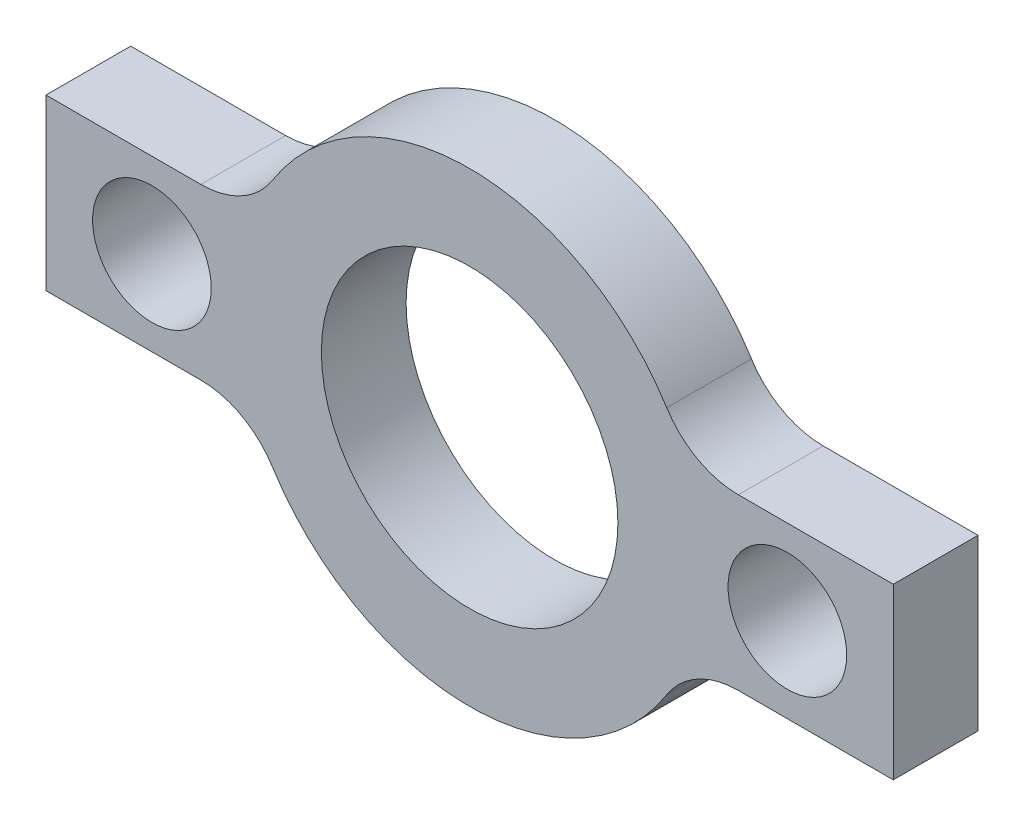
ISO-10303-21;
HEADER;
FILE_DESCRIPTION(('STEP AP214'),'2;1');
FILE_NAME('part.step','',(''),(''),'','','');
FILE_SCHEMA(('AUTOMOTIVE_DESIGN { 1 0 10303 214 1 1 1 1 }'));
ENDSEC;
DATA;
#1=APPLICATION_CONTEXT('core data for automotive mechanical design processes');
#2=APPLICATION_PROTOCOL_DEFINITION('international standard','automotive_design',2000,#1);
#3=PRODUCT_CONTEXT('',#1,'mechanical');
#4=PRODUCT('Part','Part','',(#3));
#5=PRODUCT_RELATED_PRODUCT_CATEGORY('part','',(#4));
#6=PRODUCT_DEFINITION_FORMATION('','',#4);
#7=PRODUCT_DEFINITION_CONTEXT('part definition',#1,'design');
#8=PRODUCT_DEFINITION('design','',#6,#7);
#9=PRODUCT_DEFINITION_SHAPE('','',#8);
#10=(LENGTH_UNIT() NAMED_UNIT(*) SI_UNIT(.MILLI.,.METRE.));
#11=(NAMED_UNIT(*) PLANE_ANGLE_UNIT() SI_UNIT($,.RADIAN.));
#12=(NAMED_UNIT(*) SI_UNIT($,.STERADIAN.) SOLID_ANGLE_UNIT());
#13=UNCERTAINTY_MEASURE_WITH_UNIT(LENGTH_MEASURE(1.E-05),#10,'distance_accuracy_value','');
#14=(GEOMETRIC_REPRESENTATION_CONTEXT(3) GLOBAL_UNCERTAINTY_ASSIGNED_CONTEXT((#13)) GLOBAL_UNIT_ASSIGNED_CONTEXT((#10,
#11,#12)) REPRESENTATION_CONTEXT('',''));
#15=CARTESIAN_POINT('',(0.,0.,0.));
#16=DIRECTION('',(0.,0.,1.));
#17=DIRECTION('',(1.,0.,0.));
#18=AXIS2_PLACEMENT_3D('',#15,#16,#17);
#19=CARTESIAN_POINT('',(6.34428877022476,4.,2.));
#20=DIRECTION('',(0.,0.,1.));
#21=DIRECTION('',(1.,0.,0.));
#22=AXIS2_PLACEMENT_3D('',#19,#20,#21);
#23=PLANE('',#22);
#24=CARTESIAN_POINT('',(-7.5,0.,2.));
#25=DIRECTION('',(0.,0.,1.));
#26=DIRECTION('',(1.,0.,0.));
#27=AXIS2_PLACEMENT_3D('',#24,#25,#26);
#28=CIRCLE('',#27,1.4);
#29=CARTESIAN_POINT('',(-6.1,0.,2.));
#30=VERTEX_POINT('',#29);
#31=EDGE_CURVE('E289',#30,#30,#28,.T.);
#32=ORIENTED_EDGE('',*,*,#31,.F.);
#33=EDGE_LOOP('',(#32));
#34=FACE_BOUND('',#33,.T.);
#35=CARTESIAN_POINT('',(6.34428877022476,4.,2.));
#36=DIRECTION('',(0.,0.,-1.));
#37=DIRECTION('',(1.,0.,0.));
#38=AXIS2_PLACEMENT_3D('',#35,#36,#37);
#39=CIRCLE('',#38,2.);
#40=CARTESIAN_POINT('',(6.34428877022476,2.,2.));
#41=VERTEX_POINT('',#40);
#42=CARTESIAN_POINT('',(4.65247843149816,2.93333333333333,2.));
#43=VERTEX_POINT('',#42);
#44=EDGE_CURVE('E180',#41,#43,#39,.T.);
#45=ORIENTED_EDGE('',*,*,#44,.T.);
#46=CARTESIAN_POINT('',(0.,0.,2.));
#47=DIRECTION('',(0.,0.,1.));
#48=DIRECTION('',(1.,0.,0.));
#49=AXIS2_PLACEMENT_3D('',#46,#47,#48);
#50=CIRCLE('',#49,5.5);
#51=CARTESIAN_POINT('',(-4.65247843149816,2.93333333333333,2.));
#52=VERTEX_POINT('',#51);
#53=EDGE_CURVE('E108',#43,#52,#50,.T.);
#54=ORIENTED_EDGE('',*,*,#53,.T.);
#55=CARTESIAN_POINT('',(-6.34428877022476,4.,2.));
#56=DIRECTION('',(0.,0.,-1.));
#57=DIRECTION('',(1.,0.,0.));
#58=AXIS2_PLACEMENT_3D('',#55,#56,#57);
#59=CIRCLE('',#58,2.);
#60=CARTESIAN_POINT('',(-6.34428877022476,2.,2.));
#61=VERTEX_POINT('',#60);
#62=EDGE_CURVE('E207',#52,#61,#59,.T.);
#63=ORIENTED_EDGE('',*,*,#62,.T.);
#64=DIRECTION('',(-1.,0.,0.));
#65=VECTOR('',#64,1.);
#66=CARTESIAN_POINT('',(-10.,2.,2.));
#67=LINE('',#66,#65);
#68=CARTESIAN_POINT('',(-10.,2.,2.));
#69=VERTEX_POINT('',#68);
#70=EDGE_CURVE('E226',#61,#69,#67,.T.);
#71=ORIENTED_EDGE('',*,*,#70,.T.);
#72=DIRECTION('',(0.,-1.,0.));
#73=VECTOR('',#72,1.);
#74=CARTESIAN_POINT('',(-10.,2.,2.));
#75=LINE('',#74,#73);
#76=CARTESIAN_POINT('',(-10.,-2.,2.));
#77=VERTEX_POINT('',#76);
#78=EDGE_CURVE('E223',#69,#77,#75,.T.);
#79=ORIENTED_EDGE('',*,*,#78,.T.);
#80=DIRECTION('',(1.,0.,0.));
#81=VECTOR('',#80,1.);
#82=CARTESIAN_POINT('',(-10.,-2.,2.));
#83=LINE('',#82,#81);
#84=CARTESIAN_POINT('',(-6.34428877022476,-2.,2.));
#85=VERTEX_POINT('',#84);
#86=EDGE_CURVE('E225',#77,#85,#83,.T.);
#87=ORIENTED_EDGE('',*,*,#86,.T.);
#88=CARTESIAN_POINT('',(-6.34428877022476,-4.,2.));
#89=DIRECTION('',(0.,0.,-1.));
#90=DIRECTION('',(-1.,0.,0.));
#91=AXIS2_PLACEMENT_3D('',#88,#89,#90);
#92=CIRCLE('',#91,2.);
#93=CARTESIAN_POINT('',(-4.65247843149816,-2.93333333333333,2.));
#94=VERTEX_POINT('',#93);
#95=EDGE_CURVE('E228',#85,#94,#92,.T.);
#96=ORIENTED_EDGE('',*,*,#95,.T.);
#97=CARTESIAN_POINT('',(0.,0.,2.));
#98=DIRECTION('',(0.,0.,1.));
#99=DIRECTION('',(1.,0.,0.));
#100=AXIS2_PLACEMENT_3D('',#97,#98,#99);
#101=CIRCLE('',#100,5.5);
#102=CARTESIAN_POINT('',(4.65247843149815,-2.93333333333334,2.));
#103=VERTEX_POINT('',#102);
#104=EDGE_CURVE('E234',#94,#103,#101,.T.);
#105=ORIENTED_EDGE('',*,*,#104,.T.);
#106=CARTESIAN_POINT('',(6.34428877022476,-4.,2.));
#107=DIRECTION('',(0.,0.,-1.));
#108=DIRECTION('',(1.,0.,0.));
#109=AXIS2_PLACEMENT_3D('',#106,#107,#108);
#110=CIRCLE('',#109,2.);
#111=CARTESIAN_POINT('',(6.34428877022476,-2.,2.));
#112=VERTEX_POINT('',#111);
#113=EDGE_CURVE('E139',#103,#112,#110,.T.);
#114=ORIENTED_EDGE('',*,*,#113,.T.);
#115=DIRECTION('',(1.,0.,0.));
#116=VECTOR('',#115,1.);
#117=CARTESIAN_POINT('',(6.34428877022476,-2.,2.));
#118=LINE('',#117,#116);
#119=CARTESIAN_POINT('',(10.,-2.,2.));
#120=VERTEX_POINT('',#119);
#121=EDGE_CURVE('E133',#112,#120,#118,.T.);
#122=ORIENTED_EDGE('',*,*,#121,.T.);
#123=DIRECTION('',(0.,1.,0.));
#124=VECTOR('',#123,1.);
#125=CARTESIAN_POINT('',(10.,2.,2.));
#126=LINE('',#125,#124);
#127=CARTESIAN_POINT('',(10.,2.,2.));
#128=VERTEX_POINT('',#127);
#129=EDGE_CURVE('E137',#120,#128,#126,.T.);
#130=ORIENTED_EDGE('',*,*,#129,.T.);
#131=DIRECTION('',(-1.,0.,0.));
#132=VECTOR('',#131,1.);
#133=CARTESIAN_POINT('',(6.34428877022476,2.,2.));
#134=LINE('',#133,#132);
#135=EDGE_CURVE('E53',#128,#41,#134,.T.);
#136=ORIENTED_EDGE('',*,*,#135,.T.);
#137=EDGE_LOOP('',(#45,#54,#63,#71,#79,#87,#96,#105,#114,#122,#130,#136));
#138=FACE_BOUND('',#137,.T.);
#139=CARTESIAN_POINT('',(0.,0.,2.));
#140=DIRECTION('',(0.,0.,1.));
#141=DIRECTION('',(1.,0.,0.));
#142=AXIS2_PLACEMENT_3D('',#139,#140,#141);
#143=CIRCLE('',#142,3.5);
#144=CARTESIAN_POINT('',(3.5,0.,2.));
#145=VERTEX_POINT('',#144);
#146=EDGE_CURVE('E161',#145,#145,#143,.T.);
#147=ORIENTED_EDGE('',*,*,#146,.F.);
#148=EDGE_LOOP('',(#147));
#149=FACE_BOUND('',#148,.T.);
#150=CARTESIAN_POINT('',(7.5,0.,2.));
#151=DIRECTION('',(0.,0.,1.));
#152=DIRECTION('',(1.,0.,0.));
#153=AXIS2_PLACEMENT_3D('',#150,#151,#152);
#154=CIRCLE('',#153,1.4);
#155=CARTESIAN_POINT('',(8.9,0.,2.));
#156=VERTEX_POINT('',#155);
#157=EDGE_CURVE('E280',#156,#156,#154,.T.);
#158=ORIENTED_EDGE('',*,*,#157,.F.);
#159=EDGE_LOOP('',(#158));
#160=FACE_BOUND('',#159,.T.);
#161=ADVANCED_FACE('F36',(#34,#138,#149,#160),#23,.T.);
#162=CARTESIAN_POINT('',(6.34428877022476,4.,0.));
#163=DIRECTION('',(0.,0.,1.));
#164=DIRECTION('',(1.,0.,0.));
#165=AXIS2_PLACEMENT_3D('',#162,#163,#164);
#166=PLANE('',#165);
#167=CARTESIAN_POINT('',(6.34428877022476,4.,0.));
#168=DIRECTION('',(0.,0.,-1.));
#169=DIRECTION('',(1.,0.,0.));
#170=AXIS2_PLACEMENT_3D('',#167,#168,#169);
#171=CIRCLE('',#170,2.);
#172=CARTESIAN_POINT('',(6.34428877022476,2.,0.));
#173=VERTEX_POINT('',#172);
#174=CARTESIAN_POINT('',(4.65247843149816,2.93333333333333,0.));
#175=VERTEX_POINT('',#174);
#176=EDGE_CURVE('E157',#173,#175,#171,.T.);
#177=ORIENTED_EDGE('',*,*,#176,.F.);
#178=DIRECTION('',(-1.,0.,0.));
#179=VECTOR('',#178,1.);
#180=CARTESIAN_POINT('',(6.34428877022476,2.,0.));
#181=LINE('',#180,#179);
#182=CARTESIAN_POINT('',(10.,2.,0.));
#183=VERTEX_POINT('',#182);
#184=EDGE_CURVE('E100',#183,#173,#181,.T.);
#185=ORIENTED_EDGE('',*,*,#184,.F.);
#186=DIRECTION('',(0.,1.,0.));
#187=VECTOR('',#186,1.);
#188=CARTESIAN_POINT('',(10.,2.,0.));
#189=LINE('',#188,#187);
#190=CARTESIAN_POINT('',(10.,-2.,0.));
#191=VERTEX_POINT('',#190);
#192=EDGE_CURVE('E94',#191,#183,#189,.T.);
#193=ORIENTED_EDGE('',*,*,#192,.F.);
#194=DIRECTION('',(1.,0.,0.));
#195=VECTOR('',#194,1.);
#196=CARTESIAN_POINT('',(6.34428877022476,-2.,0.));
#197=LINE('',#196,#195);
#198=CARTESIAN_POINT('',(6.34428877022476,-2.,0.));
#199=VERTEX_POINT('',#198);
#200=EDGE_CURVE('E147',#199,#191,#197,.T.);
#201=ORIENTED_EDGE('',*,*,#200,.F.);
#202=CARTESIAN_POINT('',(6.34428877022476,-4.,0.));
#203=DIRECTION('',(0.,0.,-1.));
#204=DIRECTION('',(1.,0.,0.));
#205=AXIS2_PLACEMENT_3D('',#202,#203,#204);
#206=CIRCLE('',#205,2.);
#207=CARTESIAN_POINT('',(4.65247843149815,-2.93333333333334,0.));
#208=VERTEX_POINT('',#207);
#209=EDGE_CURVE('E175',#208,#199,#206,.T.);
#210=ORIENTED_EDGE('',*,*,#209,.F.);
#211=CARTESIAN_POINT('',(0.,0.,0.));
#212=DIRECTION('',(0.,0.,1.));
#213=DIRECTION('',(1.,0.,0.));
#214=AXIS2_PLACEMENT_3D('',#211,#212,#213);
#215=CIRCLE('',#214,5.5);
#216=CARTESIAN_POINT('',(-4.65247843149816,-2.93333333333333,0.));
#217=VERTEX_POINT('',#216);
#218=EDGE_CURVE('E173',#217,#208,#215,.T.);
#219=ORIENTED_EDGE('',*,*,#218,.F.);
#220=CARTESIAN_POINT('',(-6.34428877022476,-4.,0.));
#221=DIRECTION('',(0.,0.,-1.));
#222=DIRECTION('',(-1.,0.,0.));
#223=AXIS2_PLACEMENT_3D('',#220,#221,#222);
#224=CIRCLE('',#223,2.);
#225=CARTESIAN_POINT('',(-6.34428877022476,-2.,0.));
#226=VERTEX_POINT('',#225);
#227=EDGE_CURVE('E171',#226,#217,#224,.T.);
#228=ORIENTED_EDGE('',*,*,#227,.F.);
#229=DIRECTION('',(1.,0.,0.));
#230=VECTOR('',#229,1.);
#231=CARTESIAN_POINT('',(-10.,-2.,0.));
#232=LINE('',#231,#230);
#233=CARTESIAN_POINT('',(-10.,-2.,0.));
#234=VERTEX_POINT('',#233);
#235=EDGE_CURVE('E169',#234,#226,#232,.T.);
#236=ORIENTED_EDGE('',*,*,#235,.F.);
#237=DIRECTION('',(0.,-1.,0.));
#238=VECTOR('',#237,1.);
#239=CARTESIAN_POINT('',(-10.,2.,0.));
#240=LINE('',#239,#238);
#241=CARTESIAN_POINT('',(-10.,2.,0.));
#242=VERTEX_POINT('',#241);
#243=EDGE_CURVE('E167',#242,#234,#240,.T.);
#244=ORIENTED_EDGE('',*,*,#243,.F.);
#245=DIRECTION('',(-1.,0.,0.));
#246=VECTOR('',#245,1.);
#247=CARTESIAN_POINT('',(-10.,2.,0.));
#248=LINE('',#247,#246);
#249=CARTESIAN_POINT('',(-6.34428877022476,2.,0.));
#250=VERTEX_POINT('',#249);
#251=EDGE_CURVE('E165',#250,#242,#248,.T.);
#252=ORIENTED_EDGE('',*,*,#251,.F.);
#253=CARTESIAN_POINT('',(-6.34428877022476,4.,0.));
#254=DIRECTION('',(0.,0.,-1.));
#255=DIRECTION('',(1.,0.,0.));
#256=AXIS2_PLACEMENT_3D('',#253,#254,#255);
#257=CIRCLE('',#256,2.);
#258=CARTESIAN_POINT('',(-4.65247843149816,2.93333333333333,0.));
#259=VERTEX_POINT('',#258);
#260=EDGE_CURVE('E163',#259,#250,#257,.T.);
#261=ORIENTED_EDGE('',*,*,#260,.F.);
#262=CARTESIAN_POINT('',(0.,0.,0.));
#263=DIRECTION('',(0.,0.,1.));
#264=DIRECTION('',(1.,0.,0.));
#265=AXIS2_PLACEMENT_3D('',#262,#263,#264);
#266=CIRCLE('',#265,5.5);
#267=EDGE_CURVE('E160',#175,#259,#266,.T.);
#268=ORIENTED_EDGE('',*,*,#267,.F.);
#269=EDGE_LOOP('',(#177,#185,#193,#201,#210,#219,#228,#236,#244,#252,#261,#268));
#270=FACE_BOUND('',#269,.T.);
#271=CARTESIAN_POINT('',(0.,0.,0.));
#272=DIRECTION('',(0.,0.,1.));
#273=DIRECTION('',(1.,0.,0.));
#274=AXIS2_PLACEMENT_3D('',#271,#272,#273);
#275=CIRCLE('',#274,3.5);
#276=CARTESIAN_POINT('',(3.5,0.,0.));
#277=VERTEX_POINT('',#276);
#278=EDGE_CURVE('E292',#277,#277,#275,.T.);
#279=ORIENTED_EDGE('',*,*,#278,.T.);
#280=EDGE_LOOP('',(#279));
#281=FACE_BOUND('',#280,.T.);
#282=CARTESIAN_POINT('',(-7.5,0.,0.));
#283=DIRECTION('',(0.,0.,1.));
#284=DIRECTION('',(1.,0.,0.));
#285=AXIS2_PLACEMENT_3D('',#282,#283,#284);
#286=CIRCLE('',#285,1.4);
#287=CARTESIAN_POINT('',(-6.1,0.,0.));
#288=VERTEX_POINT('',#287);
#289=EDGE_CURVE('E286',#288,#288,#286,.T.);
#290=ORIENTED_EDGE('',*,*,#289,.T.);
#291=EDGE_LOOP('',(#290));
#292=FACE_BOUND('',#291,.T.);
#293=CARTESIAN_POINT('',(7.5,0.,0.));
#294=DIRECTION('',(0.,0.,1.));
#295=DIRECTION('',(1.,0.,0.));
#296=AXIS2_PLACEMENT_3D('',#293,#294,#295);
#297=CIRCLE('',#296,1.4);
#298=CARTESIAN_POINT('',(8.9,0.,0.));
#299=VERTEX_POINT('',#298);
#300=EDGE_CURVE('E283',#299,#299,#297,.T.);
#301=ORIENTED_EDGE('',*,*,#300,.T.);
#302=EDGE_LOOP('',(#301));
#303=FACE_BOUND('',#302,.T.);
#304=ADVANCED_FACE('F211',(#270,#281,#292,#303),#166,.F.);
#305=CARTESIAN_POINT('',(6.34428877022476,4.,2.));
#306=DIRECTION('',(0.,0.,-1.));
#307=DIRECTION('',(-1.,0.,0.));
#308=AXIS2_PLACEMENT_3D('',#305,#306,#307);
#309=CYLINDRICAL_SURFACE('',#308,2.);
#310=ORIENTED_EDGE('',*,*,#176,.T.);
#311=DIRECTION('',(0.,0.,-1.));
#312=VECTOR('',#311,1.);
#313=CARTESIAN_POINT('',(4.65247843149816,2.93333333333333,2.));
#314=LINE('',#313,#312);
#315=EDGE_CURVE('E11',#43,#175,#314,.T.);
#316=ORIENTED_EDGE('',*,*,#315,.F.);
#317=ORIENTED_EDGE('',*,*,#44,.F.);
#318=DIRECTION('',(0.,0.,-1.));
#319=VECTOR('',#318,1.);
#320=CARTESIAN_POINT('',(6.34428877022476,2.,2.));
#321=LINE('',#320,#319);
#322=EDGE_CURVE('E153',#41,#173,#321,.T.);
#323=ORIENTED_EDGE('',*,*,#322,.T.);
#324=EDGE_LOOP('',(#310,#316,#317,#323));
#325=FACE_BOUND('',#324,.T.);
#326=ADVANCED_FACE('F38',(#325),#309,.F.);
#327=CARTESIAN_POINT('',(0.,0.,2.));
#328=DIRECTION('',(0.,0.,-1.));
#329=DIRECTION('',(-1.,0.,0.));
#330=AXIS2_PLACEMENT_3D('',#327,#328,#329);
#331=CYLINDRICAL_SURFACE('',#330,5.5);
#332=ORIENTED_EDGE('',*,*,#267,.T.);
#333=DIRECTION('',(0.,0.,-1.));
#334=VECTOR('',#333,1.);
#335=CARTESIAN_POINT('',(-4.65247843149816,2.93333333333333,2.));
#336=LINE('',#335,#334);
#337=EDGE_CURVE('E45',#52,#259,#336,.T.);
#338=ORIENTED_EDGE('',*,*,#337,.F.);
#339=ORIENTED_EDGE('',*,*,#53,.F.);
#340=ORIENTED_EDGE('',*,*,#315,.T.);
#341=EDGE_LOOP('',(#332,#338,#339,#340));
#342=FACE_BOUND('',#341,.T.);
#343=ADVANCED_FACE('F394',(#342),#331,.T.);
#344=CARTESIAN_POINT('',(-6.34428877022476,4.,2.));
#345=DIRECTION('',(0.,0.,-1.));
#346=DIRECTION('',(-1.,0.,0.));
#347=AXIS2_PLACEMENT_3D('',#344,#345,#346);
#348=CYLINDRICAL_SURFACE('',#347,2.);
#349=ORIENTED_EDGE('',*,*,#260,.T.);
#350=DIRECTION('',(0.,0.,-1.));
#351=VECTOR('',#350,1.);
#352=CARTESIAN_POINT('',(-6.34428877022476,2.,2.));
#353=LINE('',#352,#351);
#354=EDGE_CURVE('E199',#61,#250,#353,.T.);
#355=ORIENTED_EDGE('',*,*,#354,.F.);
#356=ORIENTED_EDGE('',*,*,#62,.F.);
#357=ORIENTED_EDGE('',*,*,#337,.T.);
#358=EDGE_LOOP('',(#349,#355,#356,#357));
#359=FACE_BOUND('',#358,.T.);
#360=ADVANCED_FACE('F205',(#359),#348,.F.);
#361=CARTESIAN_POINT('',(-10.,2.,2.));
#362=DIRECTION('',(0.,-1.,0.));
#363=DIRECTION('',(0.,0.,-1.));
#364=AXIS2_PLACEMENT_3D('',#361,#362,#363);
#365=PLANE('',#364);
#366=ORIENTED_EDGE('',*,*,#251,.T.);
#367=DIRECTION('',(0.,0.,-1.));
#368=VECTOR('',#367,1.);
#369=CARTESIAN_POINT('',(-10.,2.,2.));
#370=LINE('',#369,#368);
#371=EDGE_CURVE('E196',#69,#242,#370,.T.);
#372=ORIENTED_EDGE('',*,*,#371,.F.);
#373=ORIENTED_EDGE('',*,*,#70,.F.);
#374=ORIENTED_EDGE('',*,*,#354,.T.);
#375=EDGE_LOOP('',(#366,#372,#373,#374));
#376=FACE_BOUND('',#375,.T.);
#377=ADVANCED_FACE('F217',(#376),#365,.F.);
#378=CARTESIAN_POINT('',(-10.,2.,2.));
#379=DIRECTION('',(1.,0.,0.));
#380=DIRECTION('',(0.,0.,-1.));
#381=AXIS2_PLACEMENT_3D('',#378,#379,#380);
#382=PLANE('',#381);
#383=ORIENTED_EDGE('',*,*,#243,.T.);
#384=DIRECTION('',(0.,0.,-1.));
#385=VECTOR('',#384,1.);
#386=CARTESIAN_POINT('',(-10.,-2.,2.));
#387=LINE('',#386,#385);
#388=EDGE_CURVE('E193',#77,#234,#387,.T.);
#389=ORIENTED_EDGE('',*,*,#388,.F.);
#390=ORIENTED_EDGE('',*,*,#78,.F.);
#391=ORIENTED_EDGE('',*,*,#371,.T.);
#392=EDGE_LOOP('',(#383,#389,#390,#391));
#393=FACE_BOUND('',#392,.T.);
#394=ADVANCED_FACE('F221',(#393),#382,.F.);
#395=CARTESIAN_POINT('',(-10.,-2.,2.));
#396=DIRECTION('',(0.,1.,0.));
#397=DIRECTION('',(0.,0.,1.));
#398=AXIS2_PLACEMENT_3D('',#395,#396,#397);
#399=PLANE('',#398);
#400=ORIENTED_EDGE('',*,*,#235,.T.);
#401=DIRECTION('',(0.,0.,-1.));
#402=VECTOR('',#401,1.);
#403=CARTESIAN_POINT('',(-6.34428877022476,-2.,2.));
#404=LINE('',#403,#402);
#405=EDGE_CURVE('E190',#85,#226,#404,.T.);
#406=ORIENTED_EDGE('',*,*,#405,.F.);
#407=ORIENTED_EDGE('',*,*,#86,.F.);
#408=ORIENTED_EDGE('',*,*,#388,.T.);
#409=EDGE_LOOP('',(#400,#406,#407,#408));
#410=FACE_BOUND('',#409,.T.);
#411=ADVANCED_FACE('F359',(#410),#399,.F.);
#412=CARTESIAN_POINT('',(-6.34428877022476,-4.,2.));
#413=DIRECTION('',(0.,0.,-1.));
#414=DIRECTION('',(-1.,0.,0.));
#415=AXIS2_PLACEMENT_3D('',#412,#413,#414);
#416=CYLINDRICAL_SURFACE('',#415,2.);
#417=ORIENTED_EDGE('',*,*,#227,.T.);
#418=DIRECTION('',(0.,0.,-1.));
#419=VECTOR('',#418,1.);
#420=CARTESIAN_POINT('',(-4.65247843149816,-2.93333333333333,2.));
#421=LINE('',#420,#419);
#422=EDGE_CURVE('E187',#94,#217,#421,.T.);
#423=ORIENTED_EDGE('',*,*,#422,.F.);
#424=ORIENTED_EDGE('',*,*,#95,.F.);
#425=ORIENTED_EDGE('',*,*,#405,.T.);
#426=EDGE_LOOP('',(#417,#423,#424,#425));
#427=FACE_BOUND('',#426,.T.);
#428=ADVANCED_FACE('F350',(#427),#416,.F.);
#429=CARTESIAN_POINT('',(0.,0.,2.));
#430=DIRECTION('',(0.,0.,-1.));
#431=DIRECTION('',(-1.,0.,0.));
#432=AXIS2_PLACEMENT_3D('',#429,#430,#431);
#433=CYLINDRICAL_SURFACE('',#432,5.5);
#434=ORIENTED_EDGE('',*,*,#218,.T.);
#435=DIRECTION('',(0.,0.,-1.));
#436=VECTOR('',#435,1.);
#437=CARTESIAN_POINT('',(4.65247843149815,-2.93333333333334,2.));
#438=LINE('',#437,#436);
#439=EDGE_CURVE('E184',#103,#208,#438,.T.);
#440=ORIENTED_EDGE('',*,*,#439,.F.);
#441=ORIENTED_EDGE('',*,*,#104,.F.);
#442=ORIENTED_EDGE('',*,*,#422,.T.);
#443=EDGE_LOOP('',(#434,#440,#441,#442));
#444=FACE_BOUND('',#443,.T.);
#445=ADVANCED_FACE('F240',(#444),#433,.T.);
#446=CARTESIAN_POINT('',(6.34428877022476,-4.,2.));
#447=DIRECTION('',(0.,0.,-1.));
#448=DIRECTION('',(-1.,0.,0.));
#449=AXIS2_PLACEMENT_3D('',#446,#447,#448);
#450=CYLINDRICAL_SURFACE('',#449,2.);
#451=ORIENTED_EDGE('',*,*,#209,.T.);
#452=DIRECTION('',(0.,0.,-1.));
#453=VECTOR('',#452,1.);
#454=CARTESIAN_POINT('',(6.34428877022476,-2.,2.));
#455=LINE('',#454,#453);
#456=EDGE_CURVE('E148',#112,#199,#455,.T.);
#457=ORIENTED_EDGE('',*,*,#456,.F.);
#458=ORIENTED_EDGE('',*,*,#113,.F.);
#459=ORIENTED_EDGE('',*,*,#439,.T.);
#460=EDGE_LOOP('',(#451,#457,#458,#459));
#461=FACE_BOUND('',#460,.T.);
#462=ADVANCED_FACE('F244',(#461),#450,.F.);
#463=CARTESIAN_POINT('',(6.34428877022476,-2.,2.));
#464=DIRECTION('',(0.,1.,0.));
#465=DIRECTION('',(-1.,0.,0.));
#466=AXIS2_PLACEMENT_3D('',#463,#464,#465);
#467=PLANE('',#466);
#468=ORIENTED_EDGE('',*,*,#200,.T.);
#469=DIRECTION('',(0.,0.,-1.));
#470=VECTOR('',#469,1.);
#471=CARTESIAN_POINT('',(10.,-2.,2.));
#472=LINE('',#471,#470);
#473=EDGE_CURVE('E144',#120,#191,#472,.T.);
#474=ORIENTED_EDGE('',*,*,#473,.F.);
#475=ORIENTED_EDGE('',*,*,#121,.F.);
#476=ORIENTED_EDGE('',*,*,#456,.T.);
#477=EDGE_LOOP('',(#468,#474,#475,#476));
#478=FACE_BOUND('',#477,.T.);
#479=ADVANCED_FACE('F145',(#478),#467,.F.);
#480=CARTESIAN_POINT('',(10.,2.,2.));
#481=DIRECTION('',(-1.,0.,0.));
#482=DIRECTION('',(0.,-1.,0.));
#483=AXIS2_PLACEMENT_3D('',#480,#481,#482);
#484=PLANE('',#483);
#485=ORIENTED_EDGE('',*,*,#192,.T.);
#486=DIRECTION('',(0.,0.,-1.));
#487=VECTOR('',#486,1.);
#488=CARTESIAN_POINT('',(10.,2.,2.));
#489=LINE('',#488,#487);
#490=EDGE_CURVE('E149',#128,#183,#489,.T.);
#491=ORIENTED_EDGE('',*,*,#490,.F.);
#492=ORIENTED_EDGE('',*,*,#129,.F.);
#493=ORIENTED_EDGE('',*,*,#473,.T.);
#494=EDGE_LOOP('',(#485,#491,#492,#493));
#495=FACE_BOUND('',#494,.T.);
#496=ADVANCED_FACE('F151',(#495),#484,.F.);
#497=CARTESIAN_POINT('',(6.34428877022476,2.,2.));
#498=DIRECTION('',(0.,-1.,0.));
#499=DIRECTION('',(1.,0.,0.));
#500=AXIS2_PLACEMENT_3D('',#497,#498,#499);
#501=PLANE('',#500);
#502=ORIENTED_EDGE('',*,*,#184,.T.);
#503=ORIENTED_EDGE('',*,*,#322,.F.);
#504=ORIENTED_EDGE('',*,*,#135,.F.);
#505=ORIENTED_EDGE('',*,*,#490,.T.);
#506=EDGE_LOOP('',(#502,#503,#504,#505));
#507=FACE_BOUND('',#506,.T.);
#508=ADVANCED_FACE('F248',(#507),#501,.F.);
#509=CARTESIAN_POINT('',(0.,0.,2.));
#510=DIRECTION('',(0.,0.,-1.));
#511=DIRECTION('',(-1.,0.,0.));
#512=AXIS2_PLACEMENT_3D('',#509,#510,#511);
#513=CYLINDRICAL_SURFACE('',#512,3.5);
#514=ORIENTED_EDGE('',*,*,#146,.T.);
#515=EDGE_LOOP('',(#514));
#516=FACE_BOUND('',#515,.T.);
#517=ORIENTED_EDGE('',*,*,#278,.F.);
#518=EDGE_LOOP('',(#517));
#519=FACE_BOUND('',#518,.T.);
#520=ADVANCED_FACE('F250',(#516,#519),#513,.F.);
#521=CARTESIAN_POINT('',(-7.5,0.,2.));
#522=DIRECTION('',(0.,0.,-1.));
#523=DIRECTION('',(-1.,0.,0.));
#524=AXIS2_PLACEMENT_3D('',#521,#522,#523);
#525=CYLINDRICAL_SURFACE('',#524,1.4);
#526=ORIENTED_EDGE('',*,*,#31,.T.);
#527=EDGE_LOOP('',(#526));
#528=FACE_BOUND('',#527,.T.);
#529=ORIENTED_EDGE('',*,*,#289,.F.);
#530=EDGE_LOOP('',(#529));
#531=FACE_BOUND('',#530,.T.);
#532=ADVANCED_FACE('F256',(#528,#531),#525,.F.);
#533=CARTESIAN_POINT('',(7.5,0.,2.));
#534=DIRECTION('',(0.,0.,-1.));
#535=DIRECTION('',(-1.,0.,0.));
#536=AXIS2_PLACEMENT_3D('',#533,#534,#535);
#537=CYLINDRICAL_SURFACE('',#536,1.4);
#538=ORIENTED_EDGE('',*,*,#157,.T.);
#539=EDGE_LOOP('',(#538));
#540=FACE_BOUND('',#539,.T.);
#541=ORIENTED_EDGE('',*,*,#300,.F.);
#542=EDGE_LOOP('',(#541));
#543=FACE_BOUND('',#542,.T.);
#544=ADVANCED_FACE('F271',(#540,#543),#537,.F.);
#545=CLOSED_SHELL('',(#161,#304,#326,#343,#360,#377,#394,#411,#428,#445,#462,#479,#496,#508,
#520,#532,#544));
#546=MANIFOLD_SOLID_BREP('B2',#545);
#547=ADVANCED_BREP_SHAPE_REPRESENTATION('',(#18,#546),#14);
#548=SHAPE_DEFINITION_REPRESENTATION(#9,#547);
ENDSEC;
END-ISO-10303-21;
